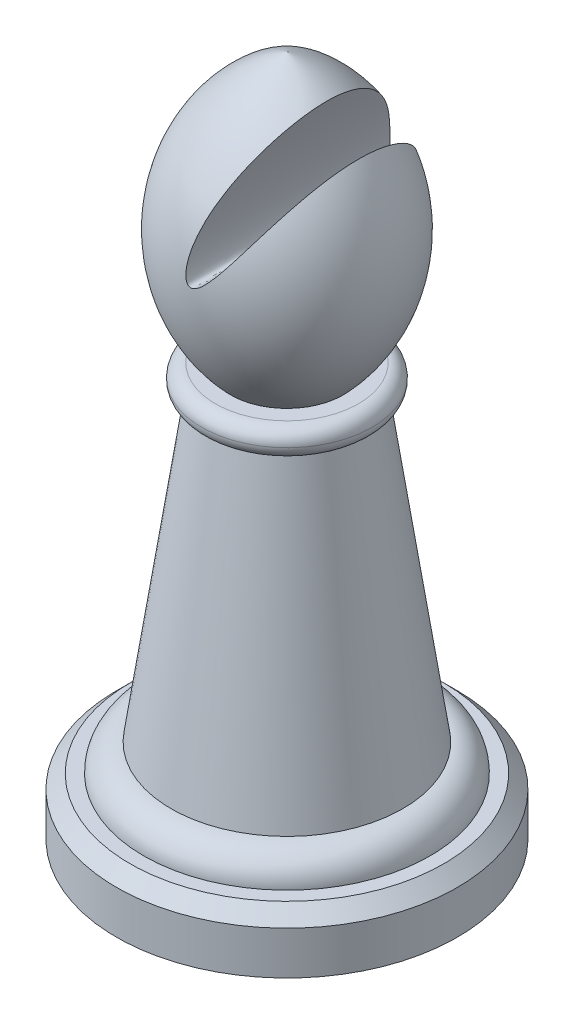
ISO-10303-21;
HEADER;
FILE_DESCRIPTION(('STEP AP214'),'2;1');
FILE_NAME('part.step','',(''),(''),'','','');
FILE_SCHEMA(('AUTOMOTIVE_DESIGN { 1 0 10303 214 1 1 1 1 }'));
ENDSEC;
DATA;
#1=APPLICATION_CONTEXT('core data for automotive mechanical design processes');
#2=APPLICATION_PROTOCOL_DEFINITION('international standard','automotive_design',2000,#1);
#3=PRODUCT_CONTEXT('',#1,'mechanical');
#4=PRODUCT('Part','Part','',(#3));
#5=PRODUCT_RELATED_PRODUCT_CATEGORY('part','',(#4));
#6=PRODUCT_DEFINITION_FORMATION('','',#4);
#7=PRODUCT_DEFINITION_CONTEXT('part definition',#1,'design');
#8=PRODUCT_DEFINITION('design','',#6,#7);
#9=PRODUCT_DEFINITION_SHAPE('','',#8);
#10=(LENGTH_UNIT() NAMED_UNIT(*) SI_UNIT(.MILLI.,.METRE.));
#11=(NAMED_UNIT(*) PLANE_ANGLE_UNIT() SI_UNIT($,.RADIAN.));
#12=(NAMED_UNIT(*) SI_UNIT($,.STERADIAN.) SOLID_ANGLE_UNIT());
#13=UNCERTAINTY_MEASURE_WITH_UNIT(LENGTH_MEASURE(1.E-05),#10,'distance_accuracy_value','');
#14=(GEOMETRIC_REPRESENTATION_CONTEXT(3) GLOBAL_UNCERTAINTY_ASSIGNED_CONTEXT((#13)) GLOBAL_UNIT_ASSIGNED_CONTEXT((#10,
#11,#12)) REPRESENTATION_CONTEXT('',''));
#15=CARTESIAN_POINT('',(0.,0.,0.));
#16=DIRECTION('',(0.,0.,1.));
#17=DIRECTION('',(1.,0.,0.));
#18=AXIS2_PLACEMENT_3D('',#15,#16,#17);
#19=CARTESIAN_POINT('',(0.,0.,0.));
#20=DIRECTION('',(0.,1.,0.));
#21=DIRECTION('',(0.,0.,1.));
#22=AXIS2_PLACEMENT_3D('',#19,#20,#21);
#23=PLANE('',#22);
#24=CARTESIAN_POINT('',(0.,0.,0.));
#25=DIRECTION('',(0.,-1.,0.));
#26=DIRECTION('',(0.,0.,-1.));
#27=AXIS2_PLACEMENT_3D('',#24,#25,#26);
#28=CIRCLE('',#27,9.525);
#29=CARTESIAN_POINT('',(0.,0.,-9.525));
#30=VERTEX_POINT('',#29);
#31=EDGE_CURVE('E101',#30,#30,#28,.T.);
#32=ORIENTED_EDGE('',*,*,#31,.T.);
#33=EDGE_LOOP('',(#32));
#34=FACE_BOUND('',#33,.T.);
#35=ADVANCED_FACE('F35',(#34),#23,.F.);
#36=CARTESIAN_POINT('',(0.,0.,0.));
#37=DIRECTION('',(0.,-1.,0.));
#38=DIRECTION('',(0.,0.,-1.));
#39=AXIS2_PLACEMENT_3D('',#36,#37,#38);
#40=CYLINDRICAL_SURFACE('',#39,9.525);
#41=CARTESIAN_POINT('',(0.,2.41300000000001,0.));
#42=DIRECTION('',(0.,-1.,0.));
#43=DIRECTION('',(0.,0.,-1.));
#44=AXIS2_PLACEMENT_3D('',#41,#42,#43);
#45=CIRCLE('',#44,9.525);
#46=CARTESIAN_POINT('',(0.,2.41300000000001,-9.525));
#47=VERTEX_POINT('',#46);
#48=EDGE_CURVE('E49',#47,#47,#45,.T.);
#49=ORIENTED_EDGE('',*,*,#48,.T.);
#50=EDGE_LOOP('',(#49));
#51=FACE_BOUND('',#50,.T.);
#52=ORIENTED_EDGE('',*,*,#31,.F.);
#53=EDGE_LOOP('',(#52));
#54=FACE_BOUND('',#53,.T.);
#55=ADVANCED_FACE('F71',(#51,#54),#40,.T.);
#56=CARTESIAN_POINT('',(-8.001,3.175,0.));
#57=DIRECTION('',(0.,-1.,0.));
#58=DIRECTION('',(0.,0.,-1.));
#59=AXIS2_PLACEMENT_3D('',#56,#57,#58);
#60=PLANE('',#59);
#61=CARTESIAN_POINT('',(0.,3.175,0.));
#62=DIRECTION('',(0.,-1.,0.));
#63=DIRECTION('',(0.,0.,-1.));
#64=AXIS2_PLACEMENT_3D('',#61,#62,#63);
#65=CIRCLE('',#64,8.76300000000001);
#66=CARTESIAN_POINT('',(0.,3.175,-8.76300000000001));
#67=VERTEX_POINT('',#66);
#68=EDGE_CURVE('E11',#67,#67,#65,.F.);
#69=ORIENTED_EDGE('',*,*,#68,.T.);
#70=EDGE_LOOP('',(#69));
#71=FACE_BOUND('',#70,.T.);
#72=CARTESIAN_POINT('',(0.,3.175,0.));
#73=DIRECTION('',(0.,-1.,0.));
#74=DIRECTION('',(0.,0.,-1.));
#75=AXIS2_PLACEMENT_3D('',#72,#73,#74);
#76=CIRCLE('',#75,8.001);
#77=CARTESIAN_POINT('',(0.,3.175,-8.001));
#78=VERTEX_POINT('',#77);
#79=EDGE_CURVE('E99',#78,#78,#76,.T.);
#80=ORIENTED_EDGE('',*,*,#79,.T.);
#81=EDGE_LOOP('',(#80));
#82=FACE_BOUND('',#81,.T.);
#83=ADVANCED_FACE('F77',(#71,#82),#60,.F.);
#84=CARTESIAN_POINT('',(0.,21.5392,0.));
#85=DIRECTION('',(0.,-1.,0.));
#86=DIRECTION('',(0.,0.,-1.));
#87=AXIS2_PLACEMENT_3D('',#84,#85,#86);
#88=CONICAL_SURFACE('',#87,4.0386,0.143796988986842);
#89=CARTESIAN_POINT('',(0.,4.699,0.));
#90=DIRECTION('',(0.,-1.,0.));
#91=DIRECTION('',(0.,0.,-1.));
#92=AXIS2_PLACEMENT_3D('',#89,#90,#91);
#93=CIRCLE('',#92,6.477);
#94=CARTESIAN_POINT('',(0.,4.699,-6.477));
#95=VERTEX_POINT('',#94);
#96=EDGE_CURVE('E96',#95,#95,#93,.T.);
#97=ORIENTED_EDGE('',*,*,#96,.F.);
#98=EDGE_LOOP('',(#97));
#99=FACE_BOUND('',#98,.T.);
#100=CARTESIAN_POINT('',(0.,21.5392,0.));
#101=DIRECTION('',(0.,-1.,0.));
#102=DIRECTION('',(0.,0.,-1.));
#103=AXIS2_PLACEMENT_3D('',#100,#101,#102);
#104=CIRCLE('',#103,4.0386);
#105=CARTESIAN_POINT('',(0.,21.5392,-4.0386));
#106=VERTEX_POINT('',#105);
#107=EDGE_CURVE('E105',#106,#106,#104,.T.);
#108=ORIENTED_EDGE('',*,*,#107,.T.);
#109=EDGE_LOOP('',(#108));
#110=FACE_BOUND('',#109,.T.);
#111=ADVANCED_FACE('F129',(#99,#110),#88,.T.);
#112=CARTESIAN_POINT('',(0.,0.,0.));
#113=DIRECTION('',(0.,-1.,0.));
#114=DIRECTION('',(0.,0.,-1.));
#115=AXIS2_PLACEMENT_3D('',#112,#113,#114);
#116=CYLINDRICAL_SURFACE('',#115,4.7625);
#117=CARTESIAN_POINT('',(0.,22.3012,0.));
#118=DIRECTION('',(0.,-1.,0.));
#119=DIRECTION('',(0.,0.,-1.));
#120=AXIS2_PLACEMENT_3D('',#117,#118,#119);
#121=CIRCLE('',#120,4.7625);
#122=CARTESIAN_POINT('',(0.,22.3012,-4.7625));
#123=VERTEX_POINT('',#122);
#124=EDGE_CURVE('E111',#123,#123,#121,.T.);
#125=ORIENTED_EDGE('',*,*,#124,.T.);
#126=EDGE_LOOP('',(#125));
#127=FACE_BOUND('',#126,.T.);
#128=CARTESIAN_POINT('',(0.,22.3002469039422,0.));
#129=DIRECTION('',(0.,-1.,0.));
#130=DIRECTION('',(0.,0.,-1.));
#131=AXIS2_PLACEMENT_3D('',#128,#129,#130);
#132=CIRCLE('',#131,4.7625);
#133=CARTESIAN_POINT('',(0.,22.3002469039422,-4.7625));
#134=VERTEX_POINT('',#133);
#135=EDGE_CURVE('E103',#134,#134,#132,.F.);
#136=ORIENTED_EDGE('',*,*,#135,.T.);
#137=EDGE_LOOP('',(#136));
#138=FACE_BOUND('',#137,.T.);
#139=ADVANCED_FACE('F64',(#127,#138),#116,.T.);
#140=CARTESIAN_POINT('',(-4.7625,23.0632,0.));
#141=DIRECTION('',(0.,-1.,0.));
#142=DIRECTION('',(0.,0.,-1.));
#143=AXIS2_PLACEMENT_3D('',#140,#141,#142);
#144=PLANE('',#143);
#145=CARTESIAN_POINT('',(0.,23.0632,0.));
#146=DIRECTION('',(0.,-1.,0.));
#147=DIRECTION('',(0.,0.,-1.));
#148=AXIS2_PLACEMENT_3D('',#145,#146,#147);
#149=CIRCLE('',#148,4.00050000000001);
#150=CARTESIAN_POINT('',(0.,23.0632,-4.00050000000001));
#151=VERTEX_POINT('',#150);
#152=EDGE_CURVE('E114',#151,#151,#149,.F.);
#153=ORIENTED_EDGE('',*,*,#152,.T.);
#154=EDGE_LOOP('',(#153));
#155=FACE_BOUND('',#154,.T.);
#156=CARTESIAN_POINT('',(0.,23.0632,0.));
#157=DIRECTION('',(0.,-1.,0.));
#158=DIRECTION('',(0.,0.,-1.));
#159=AXIS2_PLACEMENT_3D('',#156,#157,#158);
#160=CIRCLE('',#159,3.1496);
#161=CARTESIAN_POINT('',(0.,23.0632,-3.1496));
#162=VERTEX_POINT('',#161);
#163=EDGE_CURVE('E136',#162,#162,#160,.T.);
#164=ORIENTED_EDGE('',*,*,#163,.T.);
#165=EDGE_LOOP('',(#164));
#166=FACE_BOUND('',#165,.T.);
#167=ADVANCED_FACE('F55',(#155,#166),#144,.F.);
#168=CARTESIAN_POINT('',(0.,29.5087350458718,3.54726494228936));
#169=DIRECTION('',(-1.,0.,0.));
#170=DIRECTION('',(0.,0.,-1.));
#171=AXIS2_PLACEMENT_3D('',#168,#169,#170);
#172=CIRCLE('',#171,9.2947792917759);
#173=TRIMMED_CURVE('',#172,(PARAMETER_VALUE(-1.17922575889138)),
(PARAMETER_VALUE(1.17922575889138)),.T.,.PARAMETER.);
#174=CARTESIAN_POINT('',(0.,29.5087350458718,0.));
#175=DIRECTION('',(0.,-1.,0.));
#176=AXIS1_PLACEMENT('',#174,#175);
#177=SURFACE_OF_REVOLUTION('',#173,#176);
#178=CARTESIAN_POINT('',(0.270104447824258,29.7414624849274,-5.73824680585366));
#179=CARTESIAN_POINT('',(0.282458178746193,29.7357257044949,-5.73780909366409));
#180=CARTESIAN_POINT('',(0.295361587091874,29.7311611040257,-5.73727061433637));
#181=CARTESIAN_POINT('',(0.321771853814575,29.7244179896704,-5.73600937380074));
#182=CARTESIAN_POINT('',(0.335279724439315,29.7222436470329,-5.73528629314449));
#183=CARTESIAN_POINT('',(0.36640454435167,29.719708607878,-5.73345074767955));
#184=CARTESIAN_POINT('',(0.384072429311944,29.72006058375,-5.73228621124436));
#185=CARTESIAN_POINT('',(0.419113149053381,29.7235182721105,-5.72975165841393));
#186=CARTESIAN_POINT('',(0.436485220542882,29.7266302520004,-5.72838118025367));
#187=CARTESIAN_POINT('',(0.469116195653752,29.7345046877022,-5.72560796048966));
#188=CARTESIAN_POINT('',(0.484421733236511,29.7390874556577,-5.72421997975811));
#189=CARTESIAN_POINT('',(0.514581761173577,29.7495369072726,-5.72132164434867));
#190=CARTESIAN_POINT('',(0.529435832346621,29.7554047449863,-5.71981118044781));
#191=CARTESIAN_POINT('',(0.573397182716497,29.7745078162484,-5.71510583697003));
#192=CARTESIAN_POINT('',(0.601839406748189,29.789224435712,-5.71174256068295));
#193=CARTESIAN_POINT('',(0.651928306387355,29.8180883415006,-5.7052921695553));
#194=CARTESIAN_POINT('',(0.673839117122385,29.8318122122941,-5.70227406191639));
#195=CARTESIAN_POINT('',(0.716825027197311,29.860465467022,-5.69598088811912));
#196=CARTESIAN_POINT('',(0.737899942820883,29.8753951138013,-5.69270576593905));
#197=CARTESIAN_POINT('',(0.80013601976171,29.9215904935945,-5.68249016438317));
#198=CARTESIAN_POINT('',(0.840224411067118,29.9542110904346,-5.67517045385053));
#199=CARTESIAN_POINT('',(0.918378674581981,30.0218012942021,-5.65951448664618));
#200=CARTESIAN_POINT('',(0.956436537727731,30.0567791249212,-5.65117457853502));
#201=CARTESIAN_POINT('',(1.03079249553169,30.1282339579822,-5.6335141129738));
#202=CARTESIAN_POINT('',(1.06709239912623,30.1647093446927,-5.62419459626512));
#203=CARTESIAN_POINT('',(1.14319014977624,30.243850472832,-5.60321865698142));
#204=CARTESIAN_POINT('',(1.18278045647211,30.2866764631742,-5.59141718499507));
#205=CARTESIAN_POINT('',(1.26045364474579,30.3733299191639,-5.56654059407193));
#206=CARTESIAN_POINT('',(1.2985360686345,30.4171576826093,-5.55346509253292));
#207=CARTESIAN_POINT('',(1.41061043361523,30.5494124406837,-5.51242064006661));
#208=CARTESIAN_POINT('',(1.482686210477,30.6388853821801,-5.48256204217794));
#209=CARTESIAN_POINT('',(1.61098301294516,30.8039940224393,-5.42327464047217));
#210=CARTESIAN_POINT('',(1.6678317832173,30.8794260166783,-5.39461818052464));
#211=CARTESIAN_POINT('',(1.77907543912785,31.0307164821207,-5.33384528585577));
#212=CARTESIAN_POINT('',(1.83346998677346,31.1065750104579,-5.30172837661625));
#213=CARTESIAN_POINT('',(1.99345411021762,31.3343108007373,-5.2001448700575));
#214=CARTESIAN_POINT('',(2.09575064332846,31.4862253349734,-5.12548916694059));
#215=CARTESIAN_POINT('',(2.29247248979607,31.7874582359139,-4.9626446249623));
#216=CARTESIAN_POINT('',(2.38690905272794,31.9367800622788,-4.87447565939927));
#217=CARTESIAN_POINT('',(2.56863233748059,32.2313292895205,-4.68460035354245));
#218=CARTESIAN_POINT('',(2.6559135159509,32.376553459837,-4.58288367484772));
#219=CARTESIAN_POINT('',(2.82274558240402,32.6599602182635,-4.36698947651026));
#220=CARTESIAN_POINT('',(2.90235082864244,32.7981884236792,-4.25291395791461));
#221=CARTESIAN_POINT('',(3.05454894813216,33.0671776105239,-4.01183488750574));
#222=CARTESIAN_POINT('',(3.12713883163575,33.1979353986533,-3.8848258707446));
#223=CARTESIAN_POINT('',(3.26504743600652,33.4501821278314,-3.61816716350028));
#224=CARTESIAN_POINT('',(3.33036405423355,33.571668385381,-3.47851383869943));
#225=CARTESIAN_POINT('',(3.45329510088009,33.803360008426,-3.18701125645099));
#226=CARTESIAN_POINT('',(3.51091236664327,33.9135695260665,-3.03516652495305));
#227=CARTESIAN_POINT('',(3.60342893470686,34.0925371310194,-2.7625405146373));
#228=CARTESIAN_POINT('',(3.64025728528371,34.1644431464968,-2.64446884782953));
#229=CARTESIAN_POINT('',(3.70927402913323,34.3001849737513,-2.40246610957669));
#230=CARTESIAN_POINT('',(3.74146297338504,34.3640217437266,-2.27853573624104));
#231=CARTESIAN_POINT('',(3.80088147878638,34.4825947147523,-2.02536434151731));
#232=CARTESIAN_POINT('',(3.82811511496,34.5373383902999,-1.8961277918811));
#233=CARTESIAN_POINT('',(3.87732632986853,34.6367606832949,-1.63291543213341));
#234=CARTESIAN_POINT('',(3.89930616409176,34.6814436193976,-1.49894168418829));
#235=CARTESIAN_POINT('',(3.93788217031494,34.7601630194253,-1.22576233261144));
#236=CARTESIAN_POINT('',(3.95442686191014,34.7940975748427,-1.08651989229803));
#237=CARTESIAN_POINT('',(3.98155903543146,34.8498850814875,-0.805050877757463));
#238=CARTESIAN_POINT('',(3.99214660265631,34.8717382057061,-0.662824346289079));
#239=CARTESIAN_POINT('',(4.00714596930178,34.9027294584713,-0.376758538010122));
#240=CARTESIAN_POINT('',(4.01156190790886,34.911876108968,-0.232920407391758));
#241=CARTESIAN_POINT('',(4.01413406195611,34.9172012840665,0.0550434309444063));
#242=CARTESIAN_POINT('',(4.01229100769796,34.9133813216177,0.19916910315063));
#243=CARTESIAN_POINT('',(4.00305441817626,34.8942748728747,0.467011188419975));
#244=CARTESIAN_POINT('',(3.99643820986329,34.8805944603712,0.590873108517081));
#245=CARTESIAN_POINT('',(3.97864951438421,34.8439081977637,0.836914871648307));
#246=CARTESIAN_POINT('',(3.96747553150962,34.8208992863747,0.95909414887598));
#247=CARTESIAN_POINT('',(3.94073191729336,34.7660275271153,1.20093939953925));
#248=CARTESIAN_POINT('',(3.92516270954452,34.7341655324716,1.32060561397953));
#249=CARTESIAN_POINT('',(3.88982604990235,34.6621775156857,1.55680871728416));
#250=CARTESIAN_POINT('',(3.87005693114912,34.6220482126076,1.67334434293465));
#251=CARTESIAN_POINT('',(3.8033937492252,34.4874561306455,2.02462307050315));
#252=CARTESIAN_POINT('',(3.74998701369892,34.3805456732236,2.25348993736681));
#253=CARTESIAN_POINT('',(3.62803523489348,34.1401783459253,2.69226214629115));
#254=CARTESIAN_POINT('',(3.55948160576169,34.0067064242496,2.90215663860024));
#255=CARTESIAN_POINT('',(3.39378430630833,33.690026961034,3.34076816931373));
#256=CARTESIAN_POINT('',(3.29366835322198,33.5022024247597,3.56502516059372));
#257=CARTESIAN_POINT('',(3.07551549564895,33.1038792458702,3.98219927731409));
#258=CARTESIAN_POINT('',(2.95748250394764,32.8933855567325,4.17512322637895));
#259=CARTESIAN_POINT('',(2.75521898529591,32.5444602721896,4.45751261269807));
#260=CARTESIAN_POINT('',(2.67648869264002,32.4110989581848,4.5573790615057));
#261=CARTESIAN_POINT('',(2.51285283868756,32.1401019678294,4.74541374115332));
#262=CARTESIAN_POINT('',(2.42795094459582,32.0024688572236,4.83358883250949));
#263=CARTESIAN_POINT('',(2.25168053705787,31.7242927579545,4.99816823547849));
#264=CARTESIAN_POINT('',(2.16031046864724,31.5837490753672,5.07456970256412));
#265=CARTESIAN_POINT('',(1.9705462603482,31.301418899033,5.21546296642712));
#266=CARTESIAN_POINT('',(1.87215229778973,31.1596324367416,5.27995506372907));
#267=CARTESIAN_POINT('',(1.69603163619403,30.916841723139,5.38043960177352));
#268=CARTESIAN_POINT('',(1.62029034309915,30.815599820887,5.41934278300428));
#269=CARTESIAN_POINT('',(1.50285199401853,30.6650649065912,5.47301776061077));
#270=CARTESIAN_POINT('',(1.46306721757599,30.6151068312968,5.4901297818576));
#271=CARTESIAN_POINT('',(1.38204848217433,30.5158599274336,5.52279063905113));
#272=CARTESIAN_POINT('',(1.34081463162211,30.4665710491823,5.53833959159824));
#273=CARTESIAN_POINT('',(1.26243914588709,30.375664343363,5.56584438595758));
#274=CARTESIAN_POINT('',(1.22551241261148,30.333921995003,5.57800049529249));
#275=CARTESIAN_POINT('',(1.15019682816211,30.2514441049611,5.60114317456239));
#276=CARTESIAN_POINT('',(1.11180811103042,30.2107084715404,5.61212985136801));
#277=CARTESIAN_POINT('',(1.03320547562683,30.1305968837776,5.63294694519182));
#278=CARTESIAN_POINT('',(0.992988855899261,30.0912231040266,5.64277556827632));
#279=CARTESIAN_POINT('',(0.910348158106254,30.0145654415535,5.66124907705796));
#280=CARTESIAN_POINT('',(0.86792510819207,29.9772806019578,5.66989450739816));
#281=CARTESIAN_POINT('',(0.80195690505393,29.9237343978659,5.68199122531348));
#282=CARTESIAN_POINT('',(0.779503393329755,29.9062306703941,5.68588922058738));
#283=CARTESIAN_POINT('',(0.733721906219408,29.8723428735847,5.69337808504787));
#284=CARTESIAN_POINT('',(0.710394256185099,29.8559583939517,5.69696906690262));
#285=CARTESIAN_POINT('',(0.662783348542589,29.8247618700084,5.70382497243197));
#286=CARTESIAN_POINT('',(0.638504069885648,29.809944073248,5.70709108611883));
#287=CARTESIAN_POINT('',(0.588659895740351,29.7824248850749,5.71330340757802));
#288=CARTESIAN_POINT('',(0.563093432988911,29.7697261591193,5.7162492108525));
#289=CARTESIAN_POINT('',(0.51470186102705,29.7493462235994,5.72134217054551));
#290=CARTESIAN_POINT('',(0.492087259453187,29.7411882586774,5.72354183801044));
#291=CARTESIAN_POINT('',(0.445855358657404,29.7283255418194,5.72764160558681));
#292=CARTESIAN_POINT('',(0.422241719212119,29.7236091750615,5.72954269613557));
#293=CARTESIAN_POINT('',(0.384593054541197,29.72026157703,5.73223660670029));
#294=CARTESIAN_POINT('',(0.370729932903155,29.7199005321616,5.73315813739802));
#295=CARTESIAN_POINT('',(0.343118407451742,29.7213090884314,5.73484450485829));
#296=CARTESIAN_POINT('',(0.329369794174501,29.7230728970836,5.73560976099622));
#297=CARTESIAN_POINT('',(0.30223579935769,29.7290629886704,5.7369636079245));
#298=CARTESIAN_POINT('',(0.28885593699362,29.7333156335426,5.73755020362539));
#299=CARTESIAN_POINT('',(0.263166941319336,29.7443335345437,5.7385127610259));
#300=CARTESIAN_POINT('',(0.250857385725172,29.7510977941254,5.73888880611863));
#301=CARTESIAN_POINT('',(0.229056302520868,29.7658854330144,5.73939930914065));
#302=CARTESIAN_POINT('',(0.219403497459684,29.7736741945995,5.7395565963098));
#303=CARTESIAN_POINT('',(0.201337276329879,29.7905931725982,5.73972060629604));
#304=CARTESIAN_POINT('',(0.192926350420677,29.7997260128403,5.73972703057714));
#305=CARTESIAN_POINT('',(0.172343408658712,29.8250974817022,5.73956952097824));
#306=CARTESIAN_POINT('',(0.161189655975833,29.8421559025107,5.73929443177244));
#307=CARTESIAN_POINT('',(0.141555996088478,29.8777328527513,5.73846682844746));
#308=CARTESIAN_POINT('',(0.133084069830661,29.8962555390864,5.73791349871771));
#309=CARTESIAN_POINT('',(0.118225215500596,29.9341038080248,5.73658187295723));
#310=CARTESIAN_POINT('',(0.111839566636966,29.9534298750692,5.73580343945259));
#311=CARTESIAN_POINT('',(0.100702005056274,29.9924967360127,5.7340558006049));
#312=CARTESIAN_POINT('',(0.0959479298394654,30.0122369438722,5.73308685047584));
#313=CARTESIAN_POINT('',(0.0877043754424222,30.0520349322534,5.73097412913556));
#314=CARTESIAN_POINT('',(0.084219285335696,30.0720935691865,5.72982977026095));
#315=CARTESIAN_POINT('',(0.0782873121084955,30.1123543896576,5.727381255956));
#316=CARTESIAN_POINT('',(0.0758406717027934,30.1325566056335,5.72607706325972));
#317=CARTESIAN_POINT('',(0.0702086679609073,30.1889155051221,5.72223469532595));
#318=CARTESIAN_POINT('',(0.0679499618229549,30.2251530564508,5.71953122466827));
#319=CARTESIAN_POINT('',(0.0654198356328311,30.2976663282707,5.71366911401282));
#320=CARTESIAN_POINT('',(0.065149632662773,30.3339420585488,5.71051019646012));
#321=CARTESIAN_POINT('',(0.066617611714335,30.4427880208324,5.70036097162145));
#322=CARTESIAN_POINT('',(0.0706423263366232,30.5152636956308,5.69270597057323));
#323=CARTESIAN_POINT('',(0.0826658775111496,30.6598844029766,5.67564430377297));
#324=CARTESIAN_POINT('',(0.0906782844850587,30.7320274515758,5.66623172566918));
#325=CARTESIAN_POINT('',(0.109565323763667,30.8756071314089,5.6456908630676));
#326=CARTESIAN_POINT('',(0.120436947440451,30.9470444237748,5.634564387098));
#327=CARTESIAN_POINT('',(0.146382159208754,31.1013959478388,5.60854342818307));
#328=CARTESIAN_POINT('',(0.161856217866974,31.184188298386,5.59332995380428));
#329=CARTESIAN_POINT('',(0.195054275179139,31.3488679120093,5.56053608066626));
#330=CARTESIAN_POINT('',(0.212779013504288,31.430754867872,5.54295490366139));
#331=CARTESIAN_POINT('',(0.268457454249241,31.6745131472936,5.48676911871115));
#332=CARTESIAN_POINT('',(0.309008108609792,31.8349929347346,5.44463616191929));
#333=CARTESIAN_POINT('',(0.394572035104462,32.1519117146217,5.35095449519505));
#334=CARTESIAN_POINT('',(0.439584858551462,32.3083511113535,5.29940673151706));
#335=CARTESIAN_POINT('',(0.532631342256892,32.6169823900658,5.18689163625067));
#336=CARTESIAN_POINT('',(0.58066674689668,32.7691717447626,5.12591883520069));
#337=CARTESIAN_POINT('',(0.693955271077188,33.1156219523649,4.97412132382284));
#338=CARTESIAN_POINT('',(0.759904089134552,33.308193272199,4.87991832768239));
#339=CARTESIAN_POINT('',(0.893292627803517,33.6843396697813,4.67556034164186));
#340=CARTESIAN_POINT('',(0.960734054466254,33.8679035899781,4.56538620411283));
#341=CARTESIAN_POINT('',(1.1596532796424,34.394502420375,4.21703451562869));
#342=CARTESIAN_POINT('',(1.29114165827978,34.723492117175,3.95663271420918));
#343=CARTESIAN_POINT('',(1.48002484280087,35.1790932026013,3.52331789600269));
#344=CARTESIAN_POINT('',(1.54162891283542,35.3247225728024,3.37165673168853));
#345=CARTESIAN_POINT('',(1.66067089612297,35.6016177424927,3.05421196129904));
#346=CARTESIAN_POINT('',(1.71811153286014,35.7328929607764,2.88843774439701));
#347=CARTESIAN_POINT('',(1.8055749724637,35.9300959655082,2.6112301774638));
#348=CARTESIAN_POINT('',(1.83747517757811,36.00137413045,2.50415641490249));
#349=CARTESIAN_POINT('',(1.89865258994756,36.1370544225707,2.28496965036382));
#350=CARTESIAN_POINT('',(1.92792954936232,36.2014559001606,2.17285617374142));
#351=CARTESIAN_POINT('',(1.98325766809003,36.3223756449146,1.9439140783909));
#352=CARTESIAN_POINT('',(2.00931394394787,36.3789064344053,1.8270933398606));
#353=CARTESIAN_POINT('',(2.05760519918011,36.4831097067774,1.58878140672534));
#354=CARTESIAN_POINT('',(2.07984077806683,36.5307835795089,1.46729094852202));
#355=CARTESIAN_POINT('',(2.1156582838952,36.6072501545485,1.24538706597824));
#356=CARTESIAN_POINT('',(2.13007985437542,36.6379101382381,1.1457525296961));
#357=CARTESIAN_POINT('',(2.15563516917371,36.6920956626868,0.944184118320426));
#358=CARTESIAN_POINT('',(2.16677062549232,36.7156249185871,0.842251470399191));
#359=CARTESIAN_POINT('',(2.18537457558715,36.7548650941256,0.636708350621868));
#360=CARTESIAN_POINT('',(2.19284856355906,36.7705877284284,0.533100635119914));
#361=CARTESIAN_POINT('',(2.20386024872766,36.7937329425847,0.324746034855656));
#362=CARTESIAN_POINT('',(2.20739803968333,36.8011557201381,0.21999917728737));
#363=CARTESIAN_POINT('',(2.21038862196777,36.8074312142393,0.00980954159876828));
#364=CARTESIAN_POINT('',(2.20982666130452,36.806252982067,-0.0956343843142247));
#365=CARTESIAN_POINT('',(2.20460825714375,36.7952997314854,-0.305966844550672));
#366=CARTESIAN_POINT('',(2.19995180344173,36.7855246916508,-0.410855377489293));
#367=CARTESIAN_POINT('',(2.18673588829723,36.7577246573553,-0.619409982289395));
#368=CARTESIAN_POINT('',(2.17817143550755,36.7396891123594,-0.723074316353281));
#369=CARTESIAN_POINT('',(2.15746008825174,36.6959470720943,-0.928453235341011));
#370=CARTESIAN_POINT('',(2.14531095288883,36.6702357783565,-1.03016655814085));
#371=CARTESIAN_POINT('',(2.11382994253902,36.6033663630475,-1.26028531733752));
#372=CARTESIAN_POINT('',(2.09343679794257,36.5598909125963,-1.3878732004211));
#373=CARTESIAN_POINT('',(2.04819175979344,36.462847723074,-1.63826671193696));
#374=CARTESIAN_POINT('',(2.02334008023288,36.4092804683635,-1.76107256954349));
#375=CARTESIAN_POINT('',(1.96987931455357,36.2932281810535,-2.00188471835668));
#376=CARTESIAN_POINT('',(1.94126163483555,36.2307227233037,-2.1198791985732));
#377=CARTESIAN_POINT('',(1.88097170210321,36.0979788124975,-2.35058462079618));
#378=CARTESIAN_POINT('',(1.84929940441127,36.0277402463326,-2.4632954854873));
#379=CARTESIAN_POINT('',(1.7694370944758,35.849043448523,-2.73017388962347));
#380=CARTESIAN_POINT('',(1.71995023405464,35.7370335978115,-2.88158972904911));
#381=CARTESIAN_POINT('',(1.61719877758565,35.5010051987119,-3.17333665827705));
#382=CARTESIAN_POINT('',(1.56393248547567,35.3769812496274,-3.31366271093786));
#383=CARTESIAN_POINT('',(1.40019616056336,34.9893273264345,-3.71746297395133));
#384=CARTESIAN_POINT('',(1.28561066728933,34.7097240355423,-3.96432806076099));
#385=CARTESIAN_POINT('',(1.11062522362041,34.2633815651788,-4.30110425784393));
#386=CARTESIAN_POINT('',(1.05132163824359,34.1088467446289,-4.40845222308319));
#387=CARTESIAN_POINT('',(0.932871293160968,33.7920368714634,-4.610969053295));
#388=CARTESIAN_POINT('',(0.873724449045944,33.6297677283949,-4.70614701851008));
#389=CARTESIAN_POINT('',(0.756605010333359,33.2981486916385,-4.88423569336251));
#390=CARTESIAN_POINT('',(0.698632972927038,33.1287955496431,-4.96714069446864));
#391=CARTESIAN_POINT('',(0.585157986604716,32.7838179023043,-5.12047466733672));
#392=CARTESIAN_POINT('',(0.529653854243054,32.6081964772725,-5.19090966828419));
#393=CARTESIAN_POINT('',(0.439427201674948,32.3068924361346,-5.29923767973605));
#394=CARTESIAN_POINT('',(0.40361999897262,32.1827081772869,-5.3404305057052));
#395=CARTESIAN_POINT('',(0.334644856279444,31.9315754229029,-5.41693347687775));
#396=CARTESIAN_POINT('',(0.30148116371762,31.8046228802257,-5.45223425081678));
#397=CARTESIAN_POINT('',(0.246515409467738,31.5793501894496,-5.50903599436602));
#398=CARTESIAN_POINT('',(0.223907458450386,31.4815458244185,-5.53180816126223));
#399=CARTESIAN_POINT('',(0.181556934038487,31.2845339022948,-5.57394287324492));
#400=CARTESIAN_POINT('',(0.161815744084094,31.1853256929117,-5.59330377307878));
#401=CARTESIAN_POINT('',(0.126317926908735,30.9859100199972,-5.62855114111855));
#402=CARTESIAN_POINT('',(0.110548212127455,30.8857070004194,-5.64444899737546));
#403=CARTESIAN_POINT('',(0.0912329985370769,30.7345317918526,-5.66574037076968));
#404=CARTESIAN_POINT('',(0.0855191897392833,30.684014609555,-5.67240951158272));
#405=CARTESIAN_POINT('',(0.0759300237720281,30.5827049109066,-5.68489568482124));
#406=CARTESIAN_POINT('',(0.0720542821565106,30.5319124543814,-5.6907128952585));
#407=CARTESIAN_POINT('',(0.0671281314849714,30.4380827607803,-5.70064272078147));
#408=CARTESIAN_POINT('',(0.0657300258295876,30.3950781707057,-5.70487959499036));
#409=CARTESIAN_POINT('',(0.0651830933808232,30.3088987044351,-5.71273778054527));
#410=CARTESIAN_POINT('',(0.0660392439539776,30.2657236619421,-5.71635771090762));
#411=CARTESIAN_POINT('',(0.0710264459878392,30.1761205594105,-5.72320045653738));
#412=CARTESIAN_POINT('',(0.075404555553782,30.1296979660395,-5.72637124144189));
#413=CARTESIAN_POINT('',(0.0861044827791757,30.0607369941821,-5.7304912972043));
#414=CARTESIAN_POINT('',(0.0903493104939575,30.0379000643342,-5.7317570288472));
#415=CARTESIAN_POINT('',(0.100630654181785,29.9925922368986,-5.73405884009356));
#416=CARTESIAN_POINT('',(0.106667906779071,29.9701214938139,-5.73509482497271));
#417=CARTESIAN_POINT('',(0.1196465293939,29.9303842245915,-5.73671767701217));
#418=CARTESIAN_POINT('',(0.126159846544369,29.9129822745747,-5.73735298509964));
#419=CARTESIAN_POINT('',(0.141082801330401,29.8790207861434,-5.73842197665569));
#420=CARTESIAN_POINT('',(0.149488197109224,29.8624594633686,-5.73885610459214));
#421=CARTESIAN_POINT('',(0.167253764598768,29.8330838711231,-5.7394326072061));
#422=CARTESIAN_POINT('',(0.176289398165381,29.8200775024631,-5.73960861042184));
#423=CARTESIAN_POINT('',(0.196339591619481,29.7956934695047,-5.73974317662085));
#424=CARTESIAN_POINT('',(0.207348532104405,29.7843113410013,-5.7397023478642));
#425=CARTESIAN_POINT('',(0.227053776177529,29.7675822225733,-5.7394274190099));
#426=CARTESIAN_POINT('',(0.23515947040868,29.7615363243886,-5.73926804504495));
#427=CARTESIAN_POINT('',(0.252111396495245,29.7506006285212,-5.73883975995564));
#428=CARTESIAN_POINT('',(0.260957241117467,29.7457102313596,-5.73857090582811));
#429=CARTESIAN_POINT('',(0.270104447824258,29.7414624849274,-5.73824680585366));
#430=B_SPLINE_CURVE_WITH_KNOTS('',3,(#178,#179,#180,#181,#182,#183,#184,#185,#186,#187,#188,
#189,#190,#191,#192,#193,#194,#195,#196,#197,#198,#199,#200,#201,#202,#203,#204,#205,#206,#207,
#208,#209,#210,#211,#212,#213,#214,#215,#216,#217,#218,#219,#220,#221,#222,#223,#224,#225,#226,
#227,#228,#229,#230,#231,#232,#233,#234,#235,#236,#237,#238,#239,#240,#241,#242,#243,#244,#245,
#246,#247,#248,#249,#250,#251,#252,#253,#254,#255,#256,#257,#258,#259,#260,#261,#262,#263,#264,
#265,#266,#267,#268,#269,#270,#271,#272,#273,#274,#275,#276,#277,#278,#279,#280,#281,#282,#283,
#284,#285,#286,#287,#288,#289,#290,#291,#292,#293,#294,#295,#296,#297,#298,#299,#300,#301,#302,
#303,#304,#305,#306,#307,#308,#309,#310,#311,#312,#313,#314,#315,#316,#317,#318,#319,#320,#321,
#322,#323,#324,#325,#326,#327,#328,#329,#330,#331,#332,#333,#334,#335,#336,#337,#338,#339,#340,
#341,#342,#343,#344,#345,#346,#347,#348,#349,#350,#351,#352,#353,#354,#355,#356,#357,#358,#359,
#360,#361,#362,#363,#364,#365,#366,#367,#368,#369,#370,#371,#372,#373,#374,#375,#376,#377,#378,
#379,#380,#381,#382,#383,#384,#385,#386,#387,#388,#389,#390,#391,#392,#393,#394,#395,#396,#397,
#398,#399,#400,#401,#402,#403,#404,#405,#406,#407,#408,#409,#410,#411,#412,#413,#414,#415,#416,
#417,#418,#419,#420,#421,#422,#423,#424,#425,#426,#427,#428,#429),.UNSPECIFIED.,.T.,.F.,(4,2,2,
2,2,2,2,2,2,2,2,2,2,2,2,2,2,2,2,2,2,2,2,2,2,2,2,2,2,2,2,2,2,2,2,2,2,2,2,2,2,2,2,2,2,2,2,2,2,2,2,
2,2,2,2,2,2,2,2,2,2,2,2,2,2,2,2,2,2,2,2,2,2,2,2,2,2,2,2,2,2,2,2,2,2,2,2,2,2,2,2,2,2,2,2,2,2,2,2,
2,2,2,2,2,2,2,2,2,2,2,2,2,2,2,2,2,2,2,2,2,2,2,2,2,2,4),(0.,0.0408400716819833,
0.0817513009541273,0.134578004718036,0.187524975079513,0.235565030843266,0.283648407096633,
0.380014082779851,0.458064163807616,0.536131304993389,0.692562081387769,0.849570095490838,
1.006412957852,1.18487512702463,1.36339105610685,1.71927741278167,2.01530744239632,
2.31137811726445,2.9039995015134,3.49575756411355,4.08796981879031,4.67562111917676,
5.26352176552854,5.85159193020843,6.4394447797428,6.86826319400171,7.29703063944977,
7.72544387619833,8.15367286093925,8.58584823563767,9.01801742195686,9.44989662182497,
9.88172543159398,10.2556557026909,10.6297087839939,11.0037258279731,11.3778915900011,
12.1493593713021,12.9212655777869,13.8455064020521,14.7695456769911,15.3219061683453,
15.8739410851018,16.4261091660136,16.9782633114473,17.3748862432848,17.5732065098439,
17.7715119712883,17.9426051341642,18.1136826479442,18.2850217863102,18.4562817872529,
18.5424617517906,18.6286099529188,18.7144299704545,18.8003571353924,18.8726212894682,
18.9446404216577,18.9862059050925,19.0276583343199,19.0695579872126,19.1114410330839,
19.1485021497651,19.1856365989076,19.2464320155388,19.3074066907052,19.3684186828565,
19.429349494104,19.4904890903216,19.551642968716,19.6607804349166,19.7699846941813,
19.9887334924488,20.2082318526881,20.4275001622,20.6841877178129,20.9409598515166,
21.4529285573862,21.9648458350833,22.4770613075346,23.1490988521626,23.8219488629672,
25.1335661262819,25.7901659192511,26.4463322510029,26.8436617646044,27.2410287777986,
27.6377561702499,28.0344212545444,28.3498522965496,28.6651187139176,28.9799105998697,
29.2946949874188,29.6106126097599,29.9265310194485,30.242854058537,30.5593752614888,
30.9677285151064,31.3760621746176,31.785344309317,32.1946324311872,32.7779612454402,
33.3615535111763,34.5266237752793,35.1181091060427,35.7091495283677,36.3004640036923,
36.891491795842,37.2982818084771,37.7057127764196,38.0144217512471,38.3232792111265,
38.6311051395506,38.7848994222668,38.9386615235096,39.0683161753458,39.1982573427945,
39.338202609793,39.4079406764281,39.4777074427466,39.5334005915259,39.5889701036837,
39.6363295487286,39.6835562106944,39.7138115982947,39.7440512546347),.UNSPECIFIED.);
#431=CARTESIAN_POINT('',(0.270104447824258,29.7414624849274,-5.73824680585366));
#432=VERTEX_POINT('',#431);
#433=EDGE_CURVE('E40',#432,#432,#430,.T.);
#434=ORIENTED_EDGE('',*,*,#433,.T.);
#435=EDGE_LOOP('',(#434));
#436=FACE_BOUND('',#435,.T.);
#437=ORIENTED_EDGE('',*,*,#163,.F.);
#438=EDGE_LOOP('',(#437));
#439=FACE_BOUND('',#438,.T.);
#440=CARTESIAN_POINT('',(0.,38.1,0.));
#441=VERTEX_POINT('',#440);
#442=VERTEX_LOOP('',#441);
#443=FACE_BOUND('',#442,.T.);
#444=ADVANCED_FACE('F52',(#436,#439,#443),#177,.T.);
#445=CARTESIAN_POINT('',(0.,22.3012,0.));
#446=DIRECTION('',(0.,-1.,0.));
#447=DIRECTION('',(0.,0.,-1.));
#448=AXIS2_PLACEMENT_3D('',#445,#446,#447);
#449=TOROIDAL_SURFACE('',#448,4.00050000000001,0.762);
#450=ORIENTED_EDGE('',*,*,#152,.F.);
#451=EDGE_LOOP('',(#450));
#452=FACE_BOUND('',#451,.T.);
#453=ORIENTED_EDGE('',*,*,#124,.F.);
#454=EDGE_LOOP('',(#453));
#455=FACE_BOUND('',#454,.T.);
#456=ADVANCED_FACE('F54',(#452,#455),#449,.T.);
#457=CARTESIAN_POINT('',(0.,22.3002469039422,0.));
#458=DIRECTION('',(0.,-1.,0.));
#459=DIRECTION('',(0.,0.,-1.));
#460=AXIS2_PLACEMENT_3D('',#457,#458,#459);
#461=TOROIDAL_SURFACE('',#460,4.00050000000001,0.762);
#462=ORIENTED_EDGE('',*,*,#135,.F.);
#463=EDGE_LOOP('',(#462));
#464=FACE_BOUND('',#463,.T.);
#465=ORIENTED_EDGE('',*,*,#107,.F.);
#466=EDGE_LOOP('',(#465));
#467=FACE_BOUND('',#466,.T.);
#468=ADVANCED_FACE('F61',(#464,#467),#461,.T.);
#469=CARTESIAN_POINT('',(0.,3.175,0.));
#470=DIRECTION('',(0.,-1.,0.));
#471=DIRECTION('',(0.,0.,-1.));
#472=AXIS2_PLACEMENT_3D('',#469,#470,#471);
#473=TOROIDAL_SURFACE('',#472,6.477,1.524);
#474=ORIENTED_EDGE('',*,*,#96,.T.);
#475=EDGE_LOOP('',(#474));
#476=FACE_BOUND('',#475,.T.);
#477=ORIENTED_EDGE('',*,*,#79,.F.);
#478=EDGE_LOOP('',(#477));
#479=FACE_BOUND('',#478,.T.);
#480=ADVANCED_FACE('F84',(#476,#479),#473,.T.);
#481=CARTESIAN_POINT('',(0.,2.41300000000001,0.));
#482=DIRECTION('',(0.,-1.,0.));
#483=DIRECTION('',(0.,0.,-1.));
#484=AXIS2_PLACEMENT_3D('',#481,#482,#483);
#485=CONICAL_SURFACE('',#484,9.525,0.785398163397451);
#486=ORIENTED_EDGE('',*,*,#68,.F.);
#487=EDGE_LOOP('',(#486));
#488=FACE_BOUND('',#487,.T.);
#489=ORIENTED_EDGE('',*,*,#48,.F.);
#490=EDGE_LOOP('',(#489));
#491=FACE_BOUND('',#490,.T.);
#492=ADVANCED_FACE('F38',(#488,#491),#485,.T.);
#493=CARTESIAN_POINT('',(3.15412270074807,35.9495677358717,-9.525));
#494=DIRECTION('',(0.,0.,1.));
#495=DIRECTION('',(-0.421313638982047,-0.906915000210993,0.));
#496=AXIS2_PLACEMENT_3D('',#493,#494,#495);
#497=ELLIPSE('',#496,6.8453,1.2192);
#498=DIRECTION('',(0.,0.,1.));
#499=VECTOR('',#498,1.);
#500=SURFACE_OF_LINEAR_EXTRUSION('',#497,#499);
#501=ORIENTED_EDGE('',*,*,#433,.F.);
#502=EDGE_LOOP('',(#501));
#503=FACE_BOUND('',#502,.T.);
#504=ADVANCED_FACE('F91',(#503),#500,.F.);
#505=CLOSED_SHELL('',(#35,#55,#83,#111,#139,#167,#444,#456,#468,#480,#492,#504));
#506=MANIFOLD_SOLID_BREP('B2',#505);
#507=ADVANCED_BREP_SHAPE_REPRESENTATION('',(#18,#506),#14);
#508=SHAPE_DEFINITION_REPRESENTATION(#9,#507);
ENDSEC;
END-ISO-10303-21;
